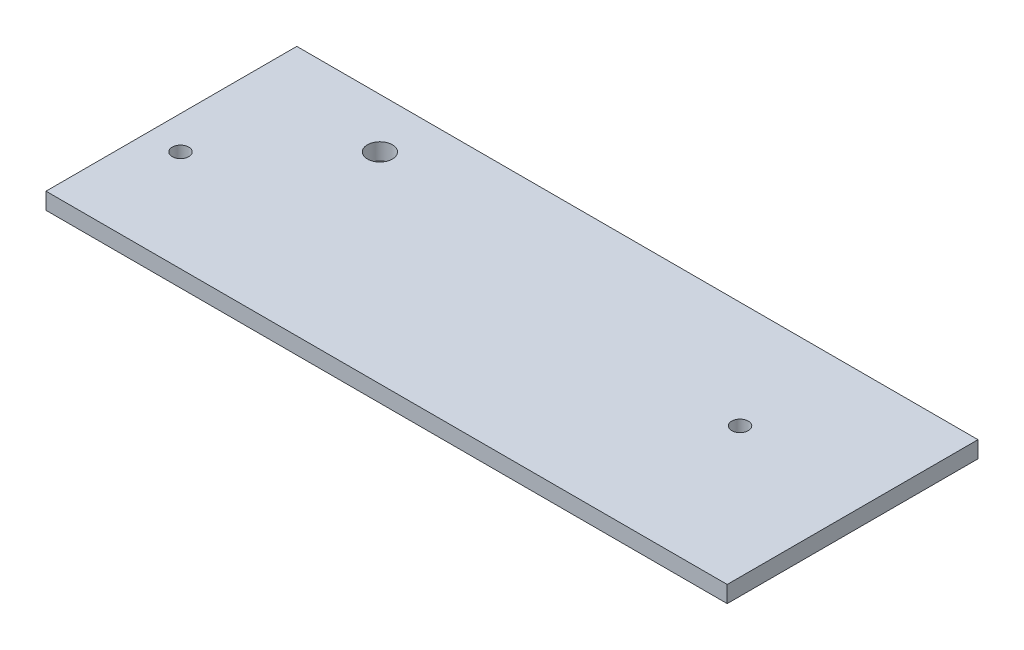
ISO-10303-21;
HEADER;
FILE_DESCRIPTION(('STEP AP214'),'2;1');
FILE_NAME('part.step','',(''),(''),'','','');
FILE_SCHEMA(('AUTOMOTIVE_DESIGN { 1 0 10303 214 1 1 1 1 }'));
ENDSEC;
DATA;
#1=APPLICATION_CONTEXT('core data for automotive mechanical design processes');
#2=APPLICATION_PROTOCOL_DEFINITION('international standard','automotive_design',2000,#1);
#3=PRODUCT_CONTEXT('',#1,'mechanical');
#4=PRODUCT('Part','Part','',(#3));
#5=PRODUCT_RELATED_PRODUCT_CATEGORY('part','',(#4));
#6=PRODUCT_DEFINITION_FORMATION('','',#4);
#7=PRODUCT_DEFINITION_CONTEXT('part definition',#1,'design');
#8=PRODUCT_DEFINITION('design','',#6,#7);
#9=PRODUCT_DEFINITION_SHAPE('','',#8);
#10=(LENGTH_UNIT() NAMED_UNIT(*) SI_UNIT(.MILLI.,.METRE.));
#11=(NAMED_UNIT(*) PLANE_ANGLE_UNIT() SI_UNIT($,.RADIAN.));
#12=(NAMED_UNIT(*) SI_UNIT($,.STERADIAN.) SOLID_ANGLE_UNIT());
#13=UNCERTAINTY_MEASURE_WITH_UNIT(LENGTH_MEASURE(1.E-05),#10,'distance_accuracy_value','');
#14=(GEOMETRIC_REPRESENTATION_CONTEXT(3) GLOBAL_UNCERTAINTY_ASSIGNED_CONTEXT((#13)) GLOBAL_UNIT_ASSIGNED_CONTEXT((#10,
#11,#12)) REPRESENTATION_CONTEXT('',''));
#15=CARTESIAN_POINT('',(0.,0.,0.));
#16=DIRECTION('',(0.,0.,1.));
#17=DIRECTION('',(1.,0.,0.));
#18=AXIS2_PLACEMENT_3D('',#15,#16,#17);
#19=CARTESIAN_POINT('',(-50.8149113885663,6.35,-19.05));
#20=DIRECTION('',(1.,0.,0.));
#21=DIRECTION('',(0.,0.,-1.));
#22=AXIS2_PLACEMENT_3D('',#19,#20,#21);
#23=PLANE('',#22);
#24=DIRECTION('',(0.,0.,1.));
#25=VECTOR('',#24,1.);
#26=CARTESIAN_POINT('',(-50.8149113885663,0.,-19.05));
#27=LINE('',#26,#25);
#28=CARTESIAN_POINT('',(-50.8149113885663,0.,-19.05));
#29=VERTEX_POINT('',#28);
#30=CARTESIAN_POINT('',(-50.8149113885663,0.,76.8043294001368));
#31=VERTEX_POINT('',#30);
#32=EDGE_CURVE('E96',#29,#31,#27,.T.);
#33=ORIENTED_EDGE('',*,*,#32,.T.);
#34=DIRECTION('',(0.,-1.,0.));
#35=VECTOR('',#34,1.);
#36=CARTESIAN_POINT('',(-50.8149113885663,6.35,76.8043294001368));
#37=LINE('',#36,#35);
#38=CARTESIAN_POINT('',(-50.8149113885663,6.35,76.8043294001368));
#39=VERTEX_POINT('',#38);
#40=EDGE_CURVE('E11',#39,#31,#37,.T.);
#41=ORIENTED_EDGE('',*,*,#40,.F.);
#42=DIRECTION('',(0.,0.,1.));
#43=VECTOR('',#42,1.);
#44=CARTESIAN_POINT('',(-50.8149113885663,6.35,-19.05));
#45=LINE('',#44,#43);
#46=CARTESIAN_POINT('',(-50.8149113885663,6.35,-19.05));
#47=VERTEX_POINT('',#46);
#48=EDGE_CURVE('E84',#47,#39,#45,.T.);
#49=ORIENTED_EDGE('',*,*,#48,.F.);
#50=DIRECTION('',(0.,-1.,0.));
#51=VECTOR('',#50,1.);
#52=CARTESIAN_POINT('',(-50.8149113885663,6.35,-19.05));
#53=LINE('',#52,#51);
#54=EDGE_CURVE('E92',#47,#29,#53,.T.);
#55=ORIENTED_EDGE('',*,*,#54,.T.);
#56=EDGE_LOOP('',(#33,#41,#49,#55));
#57=FACE_BOUND('',#56,.T.);
#58=ADVANCED_FACE('F33',(#57),#23,.F.);
#59=CARTESIAN_POINT('',(-50.8149113885663,6.35,76.8043294001368));
#60=DIRECTION('',(0.,0.,-1.));
#61=DIRECTION('',(-1.,0.,0.));
#62=AXIS2_PLACEMENT_3D('',#59,#60,#61);
#63=PLANE('',#62);
#64=DIRECTION('',(1.,0.,0.));
#65=VECTOR('',#64,1.);
#66=CARTESIAN_POINT('',(-50.8149113885663,0.,76.8043294001368));
#67=LINE('',#66,#65);
#68=CARTESIAN_POINT('',(209.535088611434,0.,76.8043294001368));
#69=VERTEX_POINT('',#68);
#70=EDGE_CURVE('E88',#31,#69,#67,.T.);
#71=ORIENTED_EDGE('',*,*,#70,.T.);
#72=DIRECTION('',(0.,-1.,0.));
#73=VECTOR('',#72,1.);
#74=CARTESIAN_POINT('',(209.535088611434,6.35,76.8043294001368));
#75=LINE('',#74,#73);
#76=CARTESIAN_POINT('',(209.535088611434,6.35,76.8043294001368));
#77=VERTEX_POINT('',#76);
#78=EDGE_CURVE('E41',#77,#69,#75,.T.);
#79=ORIENTED_EDGE('',*,*,#78,.F.);
#80=DIRECTION('',(1.,0.,0.));
#81=VECTOR('',#80,1.);
#82=CARTESIAN_POINT('',(-50.8149113885663,6.35,76.8043294001368));
#83=LINE('',#82,#81);
#84=EDGE_CURVE('E79',#39,#77,#83,.T.);
#85=ORIENTED_EDGE('',*,*,#84,.F.);
#86=ORIENTED_EDGE('',*,*,#40,.T.);
#87=EDGE_LOOP('',(#71,#79,#85,#86));
#88=FACE_BOUND('',#87,.T.);
#89=ADVANCED_FACE('F87',(#88),#63,.F.);
#90=CARTESIAN_POINT('',(209.535088611434,6.35,-19.05));
#91=DIRECTION('',(-1.,0.,0.));
#92=DIRECTION('',(0.,0.,1.));
#93=AXIS2_PLACEMENT_3D('',#90,#91,#92);
#94=PLANE('',#93);
#95=DIRECTION('',(0.,0.,-1.));
#96=VECTOR('',#95,1.);
#97=CARTESIAN_POINT('',(209.535088611434,0.,-19.05));
#98=LINE('',#97,#96);
#99=CARTESIAN_POINT('',(209.535088611434,0.,-19.05));
#100=VERTEX_POINT('',#99);
#101=EDGE_CURVE('E66',#69,#100,#98,.T.);
#102=ORIENTED_EDGE('',*,*,#101,.T.);
#103=DIRECTION('',(0.,-1.,0.));
#104=VECTOR('',#103,1.);
#105=CARTESIAN_POINT('',(209.535088611434,6.35,-19.05));
#106=LINE('',#105,#104);
#107=CARTESIAN_POINT('',(209.535088611434,6.35,-19.05));
#108=VERTEX_POINT('',#107);
#109=EDGE_CURVE('E89',#108,#100,#106,.T.);
#110=ORIENTED_EDGE('',*,*,#109,.F.);
#111=DIRECTION('',(0.,0.,-1.));
#112=VECTOR('',#111,1.);
#113=CARTESIAN_POINT('',(209.535088611434,6.35,-19.05));
#114=LINE('',#113,#112);
#115=EDGE_CURVE('E82',#77,#108,#114,.T.);
#116=ORIENTED_EDGE('',*,*,#115,.F.);
#117=ORIENTED_EDGE('',*,*,#78,.T.);
#118=EDGE_LOOP('',(#102,#110,#116,#117));
#119=FACE_BOUND('',#118,.T.);
#120=ADVANCED_FACE('F90',(#119),#94,.F.);
#121=CARTESIAN_POINT('',(-50.8149113885663,6.35,-19.05));
#122=DIRECTION('',(0.,0.,1.));
#123=DIRECTION('',(1.,0.,0.));
#124=AXIS2_PLACEMENT_3D('',#121,#122,#123);
#125=PLANE('',#124);
#126=DIRECTION('',(-1.,0.,0.));
#127=VECTOR('',#126,1.);
#128=CARTESIAN_POINT('',(-50.8149113885663,0.,-19.05));
#129=LINE('',#128,#127);
#130=EDGE_CURVE('E72',#100,#29,#129,.T.);
#131=ORIENTED_EDGE('',*,*,#130,.T.);
#132=ORIENTED_EDGE('',*,*,#54,.F.);
#133=DIRECTION('',(-1.,0.,0.));
#134=VECTOR('',#133,1.);
#135=CARTESIAN_POINT('',(-50.8149113885663,6.35,-19.05));
#136=LINE('',#135,#134);
#137=EDGE_CURVE('E49',#108,#47,#136,.T.);
#138=ORIENTED_EDGE('',*,*,#137,.F.);
#139=ORIENTED_EDGE('',*,*,#109,.T.);
#140=EDGE_LOOP('',(#131,#132,#138,#139));
#141=FACE_BOUND('',#140,.T.);
#142=ADVANCED_FACE('F104',(#141),#125,.F.);
#143=CARTESIAN_POINT('',(0.,6.35,0.));
#144=DIRECTION('',(0.,1.,0.));
#145=DIRECTION('',(0.,0.,1.));
#146=AXIS2_PLACEMENT_3D('',#143,#144,#145);
#147=PLANE('',#146);
#148=CARTESIAN_POINT('',(-38.1149113885663,6.35,38.1));
#149=DIRECTION('',(0.,1.,0.));
#150=DIRECTION('',(0.,0.,1.));
#151=AXIS2_PLACEMENT_3D('',#148,#149,#150);
#152=CIRCLE('',#151,3.17500000000001);
#153=CARTESIAN_POINT('',(-38.1149113885663,6.35,41.275));
#154=VERTEX_POINT('',#153);
#155=EDGE_CURVE('E122',#154,#154,#152,.T.);
#156=ORIENTED_EDGE('',*,*,#155,.F.);
#157=EDGE_LOOP('',(#156));
#158=FACE_BOUND('',#157,.T.);
#159=CARTESIAN_POINT('',(159.49536690431,6.35,21.8607577546449));
#160=DIRECTION('',(0.,1.,0.));
#161=DIRECTION('',(0.,0.,1.));
#162=AXIS2_PLACEMENT_3D('',#159,#160,#161);
#163=CIRCLE('',#162,3.175);
#164=CARTESIAN_POINT('',(159.49536690431,6.35,25.0357577546449));
#165=VERTEX_POINT('',#164);
#166=EDGE_CURVE('E116',#165,#165,#163,.T.);
#167=ORIENTED_EDGE('',*,*,#166,.F.);
#168=EDGE_LOOP('',(#167));
#169=FACE_BOUND('',#168,.T.);
#170=CARTESIAN_POINT('',(0.,6.35,0.));
#171=DIRECTION('',(0.,1.,0.));
#172=DIRECTION('',(0.,0.,1.));
#173=AXIS2_PLACEMENT_3D('',#170,#171,#172);
#174=CIRCLE('',#173,4.7625);
#175=CARTESIAN_POINT('',(0.,6.35,4.7625));
#176=VERTEX_POINT('',#175);
#177=EDGE_CURVE('E110',#176,#176,#174,.T.);
#178=ORIENTED_EDGE('',*,*,#177,.F.);
#179=EDGE_LOOP('',(#178));
#180=FACE_BOUND('',#179,.T.);
#181=ORIENTED_EDGE('',*,*,#48,.T.);
#182=ORIENTED_EDGE('',*,*,#84,.T.);
#183=ORIENTED_EDGE('',*,*,#115,.T.);
#184=ORIENTED_EDGE('',*,*,#137,.T.);
#185=EDGE_LOOP('',(#181,#182,#183,#184));
#186=FACE_BOUND('',#185,.T.);
#187=ADVANCED_FACE('F80',(#158,#169,#180,#186),#147,.T.);
#188=CARTESIAN_POINT('',(0.,0.,0.));
#189=DIRECTION('',(0.,1.,0.));
#190=DIRECTION('',(0.,0.,1.));
#191=AXIS2_PLACEMENT_3D('',#188,#189,#190);
#192=PLANE('',#191);
#193=CARTESIAN_POINT('',(-38.1149113885663,0.,38.1));
#194=DIRECTION('',(0.,1.,0.));
#195=DIRECTION('',(0.,0.,1.));
#196=AXIS2_PLACEMENT_3D('',#193,#194,#195);
#197=CIRCLE('',#196,3.17500000000001);
#198=CARTESIAN_POINT('',(-38.1149113885663,0.,41.275));
#199=VERTEX_POINT('',#198);
#200=EDGE_CURVE('E113',#199,#199,#197,.T.);
#201=ORIENTED_EDGE('',*,*,#200,.T.);
#202=EDGE_LOOP('',(#201));
#203=FACE_BOUND('',#202,.T.);
#204=CARTESIAN_POINT('',(159.49536690431,0.,21.8607577546449));
#205=DIRECTION('',(0.,1.,0.));
#206=DIRECTION('',(0.,0.,1.));
#207=AXIS2_PLACEMENT_3D('',#204,#205,#206);
#208=CIRCLE('',#207,3.175);
#209=CARTESIAN_POINT('',(159.49536690431,0.,25.0357577546449));
#210=VERTEX_POINT('',#209);
#211=EDGE_CURVE('E119',#210,#210,#208,.T.);
#212=ORIENTED_EDGE('',*,*,#211,.T.);
#213=EDGE_LOOP('',(#212));
#214=FACE_BOUND('',#213,.T.);
#215=CARTESIAN_POINT('',(0.,0.,0.));
#216=DIRECTION('',(0.,1.,0.));
#217=DIRECTION('',(0.,0.,1.));
#218=AXIS2_PLACEMENT_3D('',#215,#216,#217);
#219=CIRCLE('',#218,4.7625);
#220=CARTESIAN_POINT('',(0.,0.,4.7625));
#221=VERTEX_POINT('',#220);
#222=EDGE_CURVE('E99',#221,#221,#219,.T.);
#223=ORIENTED_EDGE('',*,*,#222,.T.);
#224=EDGE_LOOP('',(#223));
#225=FACE_BOUND('',#224,.T.);
#226=ORIENTED_EDGE('',*,*,#32,.F.);
#227=ORIENTED_EDGE('',*,*,#130,.F.);
#228=ORIENTED_EDGE('',*,*,#101,.F.);
#229=ORIENTED_EDGE('',*,*,#70,.F.);
#230=EDGE_LOOP('',(#226,#227,#228,#229));
#231=FACE_BOUND('',#230,.T.);
#232=ADVANCED_FACE('F107',(#203,#214,#225,#231),#192,.F.);
#233=CARTESIAN_POINT('',(0.,0.,0.));
#234=DIRECTION('',(0.,1.,0.));
#235=DIRECTION('',(0.,0.,1.));
#236=AXIS2_PLACEMENT_3D('',#233,#234,#235);
#237=CYLINDRICAL_SURFACE('',#236,4.7625);
#238=ORIENTED_EDGE('',*,*,#222,.F.);
#239=EDGE_LOOP('',(#238));
#240=FACE_BOUND('',#239,.T.);
#241=ORIENTED_EDGE('',*,*,#177,.T.);
#242=EDGE_LOOP('',(#241));
#243=FACE_BOUND('',#242,.T.);
#244=ADVANCED_FACE('F144',(#240,#243),#237,.F.);
#245=CARTESIAN_POINT('',(159.49536690431,0.,21.8607577546449));
#246=DIRECTION('',(0.,1.,0.));
#247=DIRECTION('',(0.,0.,1.));
#248=AXIS2_PLACEMENT_3D('',#245,#246,#247);
#249=CYLINDRICAL_SURFACE('',#248,3.175);
#250=ORIENTED_EDGE('',*,*,#211,.F.);
#251=EDGE_LOOP('',(#250));
#252=FACE_BOUND('',#251,.T.);
#253=ORIENTED_EDGE('',*,*,#166,.T.);
#254=EDGE_LOOP('',(#253));
#255=FACE_BOUND('',#254,.T.);
#256=ADVANCED_FACE('F133',(#252,#255),#249,.F.);
#257=CARTESIAN_POINT('',(-38.1149113885663,0.,38.1));
#258=DIRECTION('',(0.,1.,0.));
#259=DIRECTION('',(0.,0.,1.));
#260=AXIS2_PLACEMENT_3D('',#257,#258,#259);
#261=CYLINDRICAL_SURFACE('',#260,3.17500000000001);
#262=ORIENTED_EDGE('',*,*,#200,.F.);
#263=EDGE_LOOP('',(#262));
#264=FACE_BOUND('',#263,.T.);
#265=ORIENTED_EDGE('',*,*,#155,.T.);
#266=EDGE_LOOP('',(#265));
#267=FACE_BOUND('',#266,.T.);
#268=ADVANCED_FACE('F130',(#264,#267),#261,.F.);
#269=CLOSED_SHELL('',(#58,#89,#120,#142,#187,#232,#244,#256,#268));
#270=MANIFOLD_SOLID_BREP('B2',#269);
#271=ADVANCED_BREP_SHAPE_REPRESENTATION('',(#18,#270),#14);
#272=SHAPE_DEFINITION_REPRESENTATION(#9,#271);
ENDSEC;
END-ISO-10303-21;
